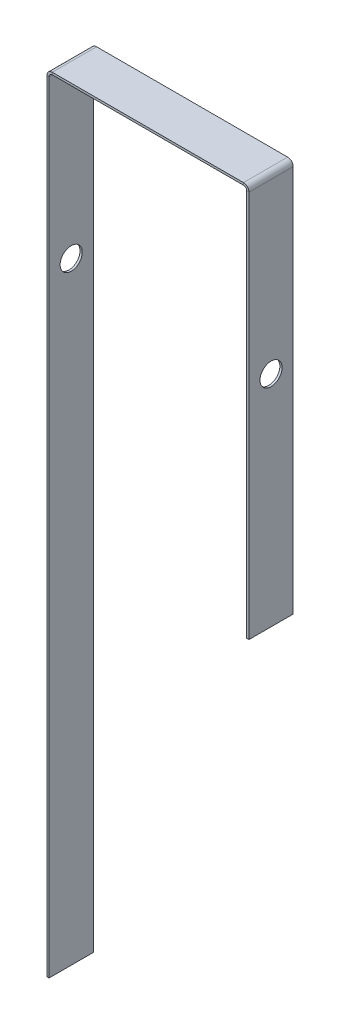
ISO-10303-21;
HEADER;
FILE_DESCRIPTION(('STEP AP214'),'2;1');
FILE_NAME('part.step','',(''),(''),'','','');
FILE_SCHEMA(('AUTOMOTIVE_DESIGN { 1 0 10303 214 1 1 1 1 }'));
ENDSEC;
DATA;
#1=APPLICATION_CONTEXT('core data for automotive mechanical design processes');
#2=APPLICATION_PROTOCOL_DEFINITION('international standard','automotive_design',2000,#1);
#3=PRODUCT_CONTEXT('',#1,'mechanical');
#4=PRODUCT('Part','Part','',(#3));
#5=PRODUCT_RELATED_PRODUCT_CATEGORY('part','',(#4));
#6=PRODUCT_DEFINITION_FORMATION('','',#4);
#7=PRODUCT_DEFINITION_CONTEXT('part definition',#1,'design');
#8=PRODUCT_DEFINITION('design','',#6,#7);
#9=PRODUCT_DEFINITION_SHAPE('','',#8);
#10=(LENGTH_UNIT() NAMED_UNIT(*) SI_UNIT(.MILLI.,.METRE.));
#11=(NAMED_UNIT(*) PLANE_ANGLE_UNIT() SI_UNIT($,.RADIAN.));
#12=(NAMED_UNIT(*) SI_UNIT($,.STERADIAN.) SOLID_ANGLE_UNIT());
#13=UNCERTAINTY_MEASURE_WITH_UNIT(LENGTH_MEASURE(1.E-05),#10,'distance_accuracy_value','');
#14=(GEOMETRIC_REPRESENTATION_CONTEXT(3) GLOBAL_UNCERTAINTY_ASSIGNED_CONTEXT((#13)) GLOBAL_UNIT_ASSIGNED_CONTEXT((#10,
#11,#12)) REPRESENTATION_CONTEXT('',''));
#15=CARTESIAN_POINT('',(0.,0.,0.));
#16=DIRECTION('',(0.,0.,1.));
#17=DIRECTION('',(1.,0.,0.));
#18=AXIS2_PLACEMENT_3D('',#15,#16,#17);
#19=CARTESIAN_POINT('',(-69.7062096522603,140.428140243275,10.));
#20=DIRECTION('',(0.,0.,1.));
#21=DIRECTION('',(1.,0.,0.));
#22=AXIS2_PLACEMENT_3D('',#19,#20,#21);
#23=PLANE('',#22);
#24=DIRECTION('',(0.,-1.,0.));
#25=VECTOR('',#24,1.);
#26=CARTESIAN_POINT('',(-69.7062096522603,140.428140243275,10.));
#27=LINE('',#26,#25);
#28=CARTESIAN_POINT('',(-69.7062096522603,140.428140243275,10.));
#29=VERTEX_POINT('',#28);
#30=CARTESIAN_POINT('',(-69.7062096522603,139.920140243275,10.));
#31=VERTEX_POINT('',#30);
#32=EDGE_CURVE('E11',#29,#31,#27,.T.);
#33=ORIENTED_EDGE('',*,*,#32,.F.);
#34=CARTESIAN_POINT('',(-69.7062096522603,139.183540243275,10.));
#35=DIRECTION('',(0.,0.,1.));
#36=DIRECTION('',(1.,0.,0.));
#37=AXIS2_PLACEMENT_3D('',#34,#35,#36);
#38=CIRCLE('',#37,1.2446);
#39=CARTESIAN_POINT('',(-70.9508096522603,139.183540243275,10.));
#40=VERTEX_POINT('',#39);
#41=EDGE_CURVE('E250',#40,#29,#38,.F.);
#42=ORIENTED_EDGE('',*,*,#41,.F.);
#43=DIRECTION('',(-1.,0.,0.));
#44=VECTOR('',#43,1.);
#45=CARTESIAN_POINT('',(-70.4428096522603,139.183540243275,10.));
#46=LINE('',#45,#44);
#47=CARTESIAN_POINT('',(-70.4428096522603,139.183540243275,10.));
#48=VERTEX_POINT('',#47);
#49=EDGE_CURVE('E46',#48,#40,#46,.T.);
#50=ORIENTED_EDGE('',*,*,#49,.F.);
#51=CARTESIAN_POINT('',(-69.7062096522603,139.183540243275,10.));
#52=DIRECTION('',(0.,0.,1.));
#53=DIRECTION('',(1.,0.,0.));
#54=AXIS2_PLACEMENT_3D('',#51,#52,#53);
#55=CIRCLE('',#54,0.7366);
#56=EDGE_CURVE('E147',#48,#31,#55,.F.);
#57=ORIENTED_EDGE('',*,*,#56,.T.);
#58=EDGE_LOOP('',(#33,#42,#50,#57));
#59=FACE_BOUND('',#58,.T.);
#60=ADVANCED_FACE('F37',(#59),#23,.T.);
#61=CARTESIAN_POINT('',(-70.4428096522603,139.183540243275,10.));
#62=DIRECTION('',(0.,0.,1.));
#63=DIRECTION('',(1.,0.,0.));
#64=AXIS2_PLACEMENT_3D('',#61,#62,#63);
#65=PLANE('',#64);
#66=DIRECTION('',(1.,0.,0.));
#67=VECTOR('',#66,1.);
#68=CARTESIAN_POINT('',(-70.9508096522603,140.428140243275,10.));
#69=LINE('',#68,#67);
#70=CARTESIAN_POINT('',(-26.4754096522603,140.428140243275,10.));
#71=VERTEX_POINT('',#70);
#72=EDGE_CURVE('E141',#29,#71,#69,.T.);
#73=ORIENTED_EDGE('',*,*,#72,.F.);
#74=ORIENTED_EDGE('',*,*,#32,.T.);
#75=DIRECTION('',(1.,0.,0.));
#76=VECTOR('',#75,1.);
#77=CARTESIAN_POINT('',(-70.9508096522603,139.920140243275,10.));
#78=LINE('',#77,#76);
#79=CARTESIAN_POINT('',(-26.4754096522603,139.920140243275,10.));
#80=VERTEX_POINT('',#79);
#81=EDGE_CURVE('E138',#31,#80,#78,.T.);
#82=ORIENTED_EDGE('',*,*,#81,.T.);
#83=DIRECTION('',(0.,1.,0.));
#84=VECTOR('',#83,1.);
#85=CARTESIAN_POINT('',(-26.4754096522603,139.920140243275,10.));
#86=LINE('',#85,#84);
#87=EDGE_CURVE('E230',#80,#71,#86,.T.);
#88=ORIENTED_EDGE('',*,*,#87,.T.);
#89=EDGE_LOOP('',(#73,#74,#82,#88));
#90=FACE_BOUND('',#89,.T.);
#91=ADVANCED_FACE('F136',(#90),#65,.T.);
#92=CARTESIAN_POINT('',(-70.9508096522603,139.183540243275,0.));
#93=DIRECTION('',(0.,0.,-1.));
#94=DIRECTION('',(-1.,0.,0.));
#95=AXIS2_PLACEMENT_3D('',#92,#93,#94);
#96=PLANE('',#95);
#97=DIRECTION('',(1.,0.,0.));
#98=VECTOR('',#97,1.);
#99=CARTESIAN_POINT('',(-70.9508096522603,139.183540243275,0.));
#100=LINE('',#99,#98);
#101=CARTESIAN_POINT('',(-70.9508096522603,139.183540243275,0.));
#102=VERTEX_POINT('',#101);
#103=CARTESIAN_POINT('',(-70.4428096522603,139.183540243275,0.));
#104=VERTEX_POINT('',#103);
#105=EDGE_CURVE('E235',#102,#104,#100,.T.);
#106=ORIENTED_EDGE('',*,*,#105,.F.);
#107=CARTESIAN_POINT('',(-69.7062096522603,139.183540243275,0.));
#108=DIRECTION('',(0.,0.,1.));
#109=DIRECTION('',(1.,0.,0.));
#110=AXIS2_PLACEMENT_3D('',#107,#108,#109);
#111=CIRCLE('',#110,1.2446);
#112=CARTESIAN_POINT('',(-69.7062096522603,140.428140243275,0.));
#113=VERTEX_POINT('',#112);
#114=EDGE_CURVE('E187',#102,#113,#111,.F.);
#115=ORIENTED_EDGE('',*,*,#114,.T.);
#116=DIRECTION('',(0.,1.,0.));
#117=VECTOR('',#116,1.);
#118=CARTESIAN_POINT('',(-69.7062096522603,139.920140243275,0.));
#119=LINE('',#118,#117);
#120=CARTESIAN_POINT('',(-69.7062096522603,139.920140243275,0.));
#121=VERTEX_POINT('',#120);
#122=EDGE_CURVE('E233',#121,#113,#119,.T.);
#123=ORIENTED_EDGE('',*,*,#122,.F.);
#124=CARTESIAN_POINT('',(-69.7062096522603,139.183540243275,0.));
#125=DIRECTION('',(0.,0.,1.));
#126=DIRECTION('',(1.,0.,0.));
#127=AXIS2_PLACEMENT_3D('',#124,#125,#126);
#128=CIRCLE('',#127,0.7366);
#129=EDGE_CURVE('E159',#104,#121,#128,.F.);
#130=ORIENTED_EDGE('',*,*,#129,.F.);
#131=EDGE_LOOP('',(#106,#115,#123,#130));
#132=FACE_BOUND('',#131,.T.);
#133=ADVANCED_FACE('F303',(#132),#96,.T.);
#134=CARTESIAN_POINT('',(-69.7062096522603,139.920140243275,0.));
#135=DIRECTION('',(0.,0.,-1.));
#136=DIRECTION('',(-1.,0.,0.));
#137=AXIS2_PLACEMENT_3D('',#134,#135,#136);
#138=PLANE('',#137);
#139=DIRECTION('',(0.,1.,0.));
#140=VECTOR('',#139,1.);
#141=CARTESIAN_POINT('',(-70.9508096522603,-37.3718597567248,0.));
#142=LINE('',#141,#140);
#143=CARTESIAN_POINT('',(-70.9508096522603,-37.3718597567248,0.));
#144=VERTEX_POINT('',#143);
#145=EDGE_CURVE('E190',#144,#102,#142,.T.);
#146=ORIENTED_EDGE('',*,*,#145,.T.);
#147=ORIENTED_EDGE('',*,*,#105,.T.);
#148=DIRECTION('',(0.,1.,0.));
#149=VECTOR('',#148,1.);
#150=CARTESIAN_POINT('',(-70.4428096522603,-37.3718597567248,0.));
#151=LINE('',#150,#149);
#152=CARTESIAN_POINT('',(-70.4428096522603,-37.3718597567248,0.));
#153=VERTEX_POINT('',#152);
#154=EDGE_CURVE('E196',#153,#104,#151,.T.);
#155=ORIENTED_EDGE('',*,*,#154,.F.);
#156=DIRECTION('',(-1.,0.,0.));
#157=VECTOR('',#156,1.);
#158=CARTESIAN_POINT('',(-70.4428096522603,-37.3718597567248,0.));
#159=LINE('',#158,#157);
#160=EDGE_CURVE('E193',#153,#144,#159,.T.);
#161=ORIENTED_EDGE('',*,*,#160,.T.);
#162=EDGE_LOOP('',(#146,#147,#155,#161));
#163=FACE_BOUND('',#162,.T.);
#164=ADVANCED_FACE('F307',(#163),#138,.T.);
#165=CARTESIAN_POINT('',(-25.2308096522603,139.183540243275,10.));
#166=DIRECTION('',(0.,0.,1.));
#167=DIRECTION('',(1.,0.,0.));
#168=AXIS2_PLACEMENT_3D('',#165,#166,#167);
#169=PLANE('',#168);
#170=DIRECTION('',(-1.,0.,0.));
#171=VECTOR('',#170,1.);
#172=CARTESIAN_POINT('',(-25.2308096522603,139.183540243275,10.));
#173=LINE('',#172,#171);
#174=CARTESIAN_POINT('',(-25.2308096522603,139.183540243275,10.));
#175=VERTEX_POINT('',#174);
#176=CARTESIAN_POINT('',(-25.7388096522603,139.183540243275,10.));
#177=VERTEX_POINT('',#176);
#178=EDGE_CURVE('E54',#175,#177,#173,.T.);
#179=ORIENTED_EDGE('',*,*,#178,.F.);
#180=CARTESIAN_POINT('',(-26.4754096522603,139.183540243275,10.));
#181=DIRECTION('',(0.,0.,1.));
#182=DIRECTION('',(1.,0.,0.));
#183=AXIS2_PLACEMENT_3D('',#180,#181,#182);
#184=CIRCLE('',#183,1.2446);
#185=EDGE_CURVE('E260',#71,#175,#184,.F.);
#186=ORIENTED_EDGE('',*,*,#185,.F.);
#187=ORIENTED_EDGE('',*,*,#87,.F.);
#188=CARTESIAN_POINT('',(-26.4754096522603,139.183540243275,10.));
#189=DIRECTION('',(0.,0.,1.));
#190=DIRECTION('',(1.,0.,0.));
#191=AXIS2_PLACEMENT_3D('',#188,#189,#190);
#192=CIRCLE('',#191,0.7366);
#193=EDGE_CURVE('E167',#80,#177,#192,.F.);
#194=ORIENTED_EDGE('',*,*,#193,.T.);
#195=EDGE_LOOP('',(#179,#186,#187,#194));
#196=FACE_BOUND('',#195,.T.);
#197=ADVANCED_FACE('F313',(#196),#169,.T.);
#198=CARTESIAN_POINT('',(-26.4754096522603,139.920140243275,10.));
#199=DIRECTION('',(0.,0.,1.));
#200=DIRECTION('',(1.,0.,0.));
#201=AXIS2_PLACEMENT_3D('',#198,#199,#200);
#202=PLANE('',#201);
#203=DIRECTION('',(0.,-1.,0.));
#204=VECTOR('',#203,1.);
#205=CARTESIAN_POINT('',(-25.2308096522603,140.428140243275,10.));
#206=LINE('',#205,#204);
#207=CARTESIAN_POINT('',(-25.2308096522603,51.5281402432752,10.));
#208=VERTEX_POINT('',#207);
#209=EDGE_CURVE('E263',#175,#208,#206,.T.);
#210=ORIENTED_EDGE('',*,*,#209,.F.);
#211=ORIENTED_EDGE('',*,*,#178,.T.);
#212=DIRECTION('',(0.,1.,0.));
#213=VECTOR('',#212,1.);
#214=CARTESIAN_POINT('',(-25.7388096522603,140.428140243275,10.));
#215=LINE('',#214,#213);
#216=CARTESIAN_POINT('',(-25.7388096522603,51.5281402432752,10.));
#217=VERTEX_POINT('',#216);
#218=EDGE_CURVE('E108',#177,#217,#215,.F.);
#219=ORIENTED_EDGE('',*,*,#218,.T.);
#220=DIRECTION('',(-1.,0.,0.));
#221=VECTOR('',#220,1.);
#222=CARTESIAN_POINT('',(-25.2308096522603,51.5281402432752,10.));
#223=LINE('',#222,#221);
#224=EDGE_CURVE('E266',#208,#217,#223,.T.);
#225=ORIENTED_EDGE('',*,*,#224,.F.);
#226=EDGE_LOOP('',(#210,#211,#219,#225));
#227=FACE_BOUND('',#226,.T.);
#228=ADVANCED_FACE('F317',(#227),#202,.T.);
#229=CARTESIAN_POINT('',(-26.4754096522603,140.428140243275,0.));
#230=DIRECTION('',(0.,0.,-1.));
#231=DIRECTION('',(-1.,0.,0.));
#232=AXIS2_PLACEMENT_3D('',#229,#230,#231);
#233=PLANE('',#232);
#234=DIRECTION('',(0.,-1.,0.));
#235=VECTOR('',#234,1.);
#236=CARTESIAN_POINT('',(-26.4754096522603,140.428140243275,0.));
#237=LINE('',#236,#235);
#238=CARTESIAN_POINT('',(-26.4754096522603,140.428140243275,0.));
#239=VERTEX_POINT('',#238);
#240=CARTESIAN_POINT('',(-26.4754096522603,139.920140243275,0.));
#241=VERTEX_POINT('',#240);
#242=EDGE_CURVE('E95',#239,#241,#237,.T.);
#243=ORIENTED_EDGE('',*,*,#242,.F.);
#244=CARTESIAN_POINT('',(-26.4754096522603,139.183540243275,0.));
#245=DIRECTION('',(0.,0.,1.));
#246=DIRECTION('',(1.,0.,0.));
#247=AXIS2_PLACEMENT_3D('',#244,#245,#246);
#248=CIRCLE('',#247,1.2446);
#249=CARTESIAN_POINT('',(-25.2308096522603,139.183540243275,0.));
#250=VERTEX_POINT('',#249);
#251=EDGE_CURVE('E183',#239,#250,#248,.F.);
#252=ORIENTED_EDGE('',*,*,#251,.T.);
#253=DIRECTION('',(1.,0.,0.));
#254=VECTOR('',#253,1.);
#255=CARTESIAN_POINT('',(-25.7388096522603,139.183540243275,0.));
#256=LINE('',#255,#254);
#257=CARTESIAN_POINT('',(-25.7388096522603,139.183540243275,0.));
#258=VERTEX_POINT('',#257);
#259=EDGE_CURVE('E102',#258,#250,#256,.T.);
#260=ORIENTED_EDGE('',*,*,#259,.F.);
#261=CARTESIAN_POINT('',(-26.4754096522603,139.183540243275,0.));
#262=DIRECTION('',(0.,0.,1.));
#263=DIRECTION('',(1.,0.,0.));
#264=AXIS2_PLACEMENT_3D('',#261,#262,#263);
#265=CIRCLE('',#264,0.7366);
#266=EDGE_CURVE('E202',#241,#258,#265,.F.);
#267=ORIENTED_EDGE('',*,*,#266,.F.);
#268=EDGE_LOOP('',(#243,#252,#260,#267));
#269=FACE_BOUND('',#268,.T.);
#270=ADVANCED_FACE('F321',(#269),#233,.T.);
#271=CARTESIAN_POINT('',(-25.7388096522603,139.183540243275,0.));
#272=DIRECTION('',(0.,0.,-1.));
#273=DIRECTION('',(-1.,0.,0.));
#274=AXIS2_PLACEMENT_3D('',#271,#272,#273);
#275=PLANE('',#274);
#276=DIRECTION('',(1.,0.,0.));
#277=VECTOR('',#276,1.);
#278=CARTESIAN_POINT('',(-70.9508096522603,140.428140243275,0.));
#279=LINE('',#278,#277);
#280=EDGE_CURVE('E185',#113,#239,#279,.T.);
#281=ORIENTED_EDGE('',*,*,#280,.T.);
#282=ORIENTED_EDGE('',*,*,#242,.T.);
#283=DIRECTION('',(1.,0.,0.));
#284=VECTOR('',#283,1.);
#285=CARTESIAN_POINT('',(-70.9508096522603,139.920140243275,0.));
#286=LINE('',#285,#284);
#287=EDGE_CURVE('E200',#121,#241,#286,.T.);
#288=ORIENTED_EDGE('',*,*,#287,.F.);
#289=ORIENTED_EDGE('',*,*,#122,.T.);
#290=EDGE_LOOP('',(#281,#282,#288,#289));
#291=FACE_BOUND('',#290,.T.);
#292=ADVANCED_FACE('F324',(#291),#275,.T.);
#293=CARTESIAN_POINT('',(-25.7388096522603,140.428140243275,10.));
#294=DIRECTION('',(1.,0.,0.));
#295=DIRECTION('',(0.,0.,-1.));
#296=AXIS2_PLACEMENT_3D('',#293,#294,#295);
#297=PLANE('',#296);
#298=CARTESIAN_POINT('',(-25.7388096522603,101.083540243275,5.));
#299=DIRECTION('',(1.,0.,0.));
#300=DIRECTION('',(0.,0.,-1.));
#301=AXIS2_PLACEMENT_3D('',#298,#299,#300);
#302=CIRCLE('',#301,2.5);
#303=CARTESIAN_POINT('',(-25.7388096522603,101.083540243275,2.5));
#304=VERTEX_POINT('',#303);
#305=EDGE_CURVE('E177',#304,#304,#302,.T.);
#306=ORIENTED_EDGE('',*,*,#305,.T.);
#307=EDGE_LOOP('',(#306));
#308=FACE_BOUND('',#307,.T.);
#309=DIRECTION('',(0.,1.,0.));
#310=VECTOR('',#309,1.);
#311=CARTESIAN_POINT('',(-25.7388096522603,140.428140243275,0.));
#312=LINE('',#311,#310);
#313=CARTESIAN_POINT('',(-25.7388096522603,51.5281402432752,0.));
#314=VERTEX_POINT('',#313);
#315=EDGE_CURVE('E173',#258,#314,#312,.F.);
#316=ORIENTED_EDGE('',*,*,#315,.T.);
#317=DIRECTION('',(0.,0.,-1.));
#318=VECTOR('',#317,1.);
#319=CARTESIAN_POINT('',(-25.7388096522603,51.5281402432752,10.));
#320=LINE('',#319,#318);
#321=EDGE_CURVE('E226',#217,#314,#320,.T.);
#322=ORIENTED_EDGE('',*,*,#321,.F.);
#323=ORIENTED_EDGE('',*,*,#218,.F.);
#324=DIRECTION('',(0.,0.,-1.));
#325=VECTOR('',#324,1.);
#326=CARTESIAN_POINT('',(-25.7388096522603,139.183540243275,10.));
#327=LINE('',#326,#325);
#328=EDGE_CURVE('E169',#177,#258,#327,.T.);
#329=ORIENTED_EDGE('',*,*,#328,.T.);
#330=EDGE_LOOP('',(#316,#322,#323,#329));
#331=FACE_BOUND('',#330,.T.);
#332=ADVANCED_FACE('F327',(#308,#331),#297,.F.);
#333=CARTESIAN_POINT('',(-25.2308096522603,51.5281402432752,10.));
#334=DIRECTION('',(0.,-1.,0.));
#335=DIRECTION('',(0.,0.,-1.));
#336=AXIS2_PLACEMENT_3D('',#333,#334,#335);
#337=PLANE('',#336);
#338=DIRECTION('',(-1.,0.,0.));
#339=VECTOR('',#338,1.);
#340=CARTESIAN_POINT('',(-25.2308096522603,51.5281402432752,0.));
#341=LINE('',#340,#339);
#342=CARTESIAN_POINT('',(-25.2308096522603,51.5281402432752,0.));
#343=VERTEX_POINT('',#342);
#344=EDGE_CURVE('E176',#343,#314,#341,.T.);
#345=ORIENTED_EDGE('',*,*,#344,.F.);
#346=DIRECTION('',(0.,0.,-1.));
#347=VECTOR('',#346,1.);
#348=CARTESIAN_POINT('',(-25.2308096522603,51.5281402432752,10.));
#349=LINE('',#348,#347);
#350=EDGE_CURVE('E224',#208,#343,#349,.T.);
#351=ORIENTED_EDGE('',*,*,#350,.F.);
#352=ORIENTED_EDGE('',*,*,#224,.T.);
#353=ORIENTED_EDGE('',*,*,#321,.T.);
#354=EDGE_LOOP('',(#345,#351,#352,#353));
#355=FACE_BOUND('',#354,.T.);
#356=ADVANCED_FACE('F330',(#355),#337,.T.);
#357=CARTESIAN_POINT('',(-25.2308096522603,140.428140243275,10.));
#358=DIRECTION('',(1.,0.,0.));
#359=DIRECTION('',(0.,0.,-1.));
#360=AXIS2_PLACEMENT_3D('',#357,#358,#359);
#361=PLANE('',#360);
#362=CARTESIAN_POINT('',(-25.2308096522603,101.083540243275,5.));
#363=DIRECTION('',(-1.,0.,0.));
#364=DIRECTION('',(0.,0.,1.));
#365=AXIS2_PLACEMENT_3D('',#362,#363,#364);
#366=CIRCLE('',#365,2.5);
#367=CARTESIAN_POINT('',(-25.2308096522603,101.083540243275,7.50000000000001));
#368=VERTEX_POINT('',#367);
#369=EDGE_CURVE('E275',#368,#368,#366,.T.);
#370=ORIENTED_EDGE('',*,*,#369,.T.);
#371=EDGE_LOOP('',(#370));
#372=FACE_BOUND('',#371,.T.);
#373=DIRECTION('',(0.,-1.,0.));
#374=VECTOR('',#373,1.);
#375=CARTESIAN_POINT('',(-25.2308096522603,140.428140243275,0.));
#376=LINE('',#375,#374);
#377=EDGE_CURVE('E180',#250,#343,#376,.T.);
#378=ORIENTED_EDGE('',*,*,#377,.F.);
#379=DIRECTION('',(0.,0.,-1.));
#380=VECTOR('',#379,1.);
#381=CARTESIAN_POINT('',(-25.2308096522603,139.183540243275,10.));
#382=LINE('',#381,#380);
#383=EDGE_CURVE('E221',#175,#250,#382,.T.);
#384=ORIENTED_EDGE('',*,*,#383,.F.);
#385=ORIENTED_EDGE('',*,*,#209,.T.);
#386=ORIENTED_EDGE('',*,*,#350,.T.);
#387=EDGE_LOOP('',(#378,#384,#385,#386));
#388=FACE_BOUND('',#387,.T.);
#389=ADVANCED_FACE('F334',(#372,#388),#361,.T.);
#390=CARTESIAN_POINT('',(-26.4754096522603,139.183540243275,10.));
#391=DIRECTION('',(0.,0.,-1.));
#392=DIRECTION('',(-1.,0.,0.));
#393=AXIS2_PLACEMENT_3D('',#390,#391,#392);
#394=CYLINDRICAL_SURFACE('',#393,1.2446);
#395=ORIENTED_EDGE('',*,*,#251,.F.);
#396=DIRECTION('',(0.,0.,-1.));
#397=VECTOR('',#396,1.);
#398=CARTESIAN_POINT('',(-26.4754096522603,140.428140243275,10.));
#399=LINE('',#398,#397);
#400=EDGE_CURVE('E218',#71,#239,#399,.T.);
#401=ORIENTED_EDGE('',*,*,#400,.F.);
#402=ORIENTED_EDGE('',*,*,#185,.T.);
#403=ORIENTED_EDGE('',*,*,#383,.T.);
#404=EDGE_LOOP('',(#395,#401,#402,#403));
#405=FACE_BOUND('',#404,.T.);
#406=ADVANCED_FACE('F338',(#405),#394,.T.);
#407=CARTESIAN_POINT('',(-70.9508096522603,140.428140243275,10.));
#408=DIRECTION('',(0.,1.,0.));
#409=DIRECTION('',(0.,0.,1.));
#410=AXIS2_PLACEMENT_3D('',#407,#408,#409);
#411=PLANE('',#410);
#412=ORIENTED_EDGE('',*,*,#280,.F.);
#413=DIRECTION('',(0.,0.,-1.));
#414=VECTOR('',#413,1.);
#415=CARTESIAN_POINT('',(-69.7062096522603,140.428140243275,10.));
#416=LINE('',#415,#414);
#417=EDGE_CURVE('E215',#29,#113,#416,.T.);
#418=ORIENTED_EDGE('',*,*,#417,.F.);
#419=ORIENTED_EDGE('',*,*,#72,.T.);
#420=ORIENTED_EDGE('',*,*,#400,.T.);
#421=EDGE_LOOP('',(#412,#418,#419,#420));
#422=FACE_BOUND('',#421,.T.);
#423=ADVANCED_FACE('F341',(#422),#411,.T.);
#424=CARTESIAN_POINT('',(-69.7062096522603,139.183540243275,10.));
#425=DIRECTION('',(0.,0.,-1.));
#426=DIRECTION('',(-1.,0.,0.));
#427=AXIS2_PLACEMENT_3D('',#424,#425,#426);
#428=CYLINDRICAL_SURFACE('',#427,1.2446);
#429=ORIENTED_EDGE('',*,*,#114,.F.);
#430=DIRECTION('',(0.,0.,-1.));
#431=VECTOR('',#430,1.);
#432=CARTESIAN_POINT('',(-70.9508096522603,139.183540243275,10.));
#433=LINE('',#432,#431);
#434=EDGE_CURVE('E212',#40,#102,#433,.T.);
#435=ORIENTED_EDGE('',*,*,#434,.F.);
#436=ORIENTED_EDGE('',*,*,#41,.T.);
#437=ORIENTED_EDGE('',*,*,#417,.T.);
#438=EDGE_LOOP('',(#429,#435,#436,#437));
#439=FACE_BOUND('',#438,.T.);
#440=ADVANCED_FACE('F249',(#439),#428,.T.);
#441=CARTESIAN_POINT('',(-70.9508096522603,-37.3718597567248,10.));
#442=DIRECTION('',(-1.,0.,0.));
#443=DIRECTION('',(0.,0.,1.));
#444=AXIS2_PLACEMENT_3D('',#441,#442,#443);
#445=PLANE('',#444);
#446=CARTESIAN_POINT('',(-70.9508096522603,101.083540243275,5.));
#447=DIRECTION('',(-1.,0.,0.));
#448=DIRECTION('',(0.,0.,1.));
#449=AXIS2_PLACEMENT_3D('',#446,#447,#448);
#450=CIRCLE('',#449,2.5);
#451=CARTESIAN_POINT('',(-70.9508096522603,101.083540243275,7.50000000000001));
#452=VERTEX_POINT('',#451);
#453=EDGE_CURVE('E272',#452,#452,#450,.T.);
#454=ORIENTED_EDGE('',*,*,#453,.F.);
#455=EDGE_LOOP('',(#454));
#456=FACE_BOUND('',#455,.T.);
#457=ORIENTED_EDGE('',*,*,#145,.F.);
#458=DIRECTION('',(0.,0.,-1.));
#459=VECTOR('',#458,1.);
#460=CARTESIAN_POINT('',(-70.9508096522603,-37.3718597567248,10.));
#461=LINE('',#460,#459);
#462=CARTESIAN_POINT('',(-70.9508096522603,-37.3718597567248,10.));
#463=VERTEX_POINT('',#462);
#464=EDGE_CURVE('E210',#463,#144,#461,.T.);
#465=ORIENTED_EDGE('',*,*,#464,.F.);
#466=DIRECTION('',(0.,1.,0.));
#467=VECTOR('',#466,1.);
#468=CARTESIAN_POINT('',(-70.9508096522603,-37.3718597567248,10.));
#469=LINE('',#468,#467);
#470=EDGE_CURVE('E243',#463,#40,#469,.T.);
#471=ORIENTED_EDGE('',*,*,#470,.T.);
#472=ORIENTED_EDGE('',*,*,#434,.T.);
#473=EDGE_LOOP('',(#457,#465,#471,#472));
#474=FACE_BOUND('',#473,.T.);
#475=ADVANCED_FACE('F254',(#456,#474),#445,.T.);
#476=CARTESIAN_POINT('',(-70.4428096522603,-37.3718597567248,10.));
#477=DIRECTION('',(0.,-1.,0.));
#478=DIRECTION('',(0.,0.,-1.));
#479=AXIS2_PLACEMENT_3D('',#476,#477,#478);
#480=PLANE('',#479);
#481=ORIENTED_EDGE('',*,*,#160,.F.);
#482=DIRECTION('',(0.,0.,-1.));
#483=VECTOR('',#482,1.);
#484=CARTESIAN_POINT('',(-70.4428096522603,-37.3718597567248,10.));
#485=LINE('',#484,#483);
#486=CARTESIAN_POINT('',(-70.4428096522603,-37.3718597567248,10.));
#487=VERTEX_POINT('',#486);
#488=EDGE_CURVE('E208',#487,#153,#485,.T.);
#489=ORIENTED_EDGE('',*,*,#488,.F.);
#490=DIRECTION('',(-1.,0.,0.));
#491=VECTOR('',#490,1.);
#492=CARTESIAN_POINT('',(-70.4428096522603,-37.3718597567248,10.));
#493=LINE('',#492,#491);
#494=EDGE_CURVE('E255',#487,#463,#493,.T.);
#495=ORIENTED_EDGE('',*,*,#494,.T.);
#496=ORIENTED_EDGE('',*,*,#464,.T.);
#497=EDGE_LOOP('',(#481,#489,#495,#496));
#498=FACE_BOUND('',#497,.T.);
#499=ADVANCED_FACE('F350',(#498),#480,.T.);
#500=CARTESIAN_POINT('',(-70.4428096522603,-37.3718597567248,10.));
#501=DIRECTION('',(-1.,0.,0.));
#502=DIRECTION('',(0.,0.,1.));
#503=AXIS2_PLACEMENT_3D('',#500,#501,#502);
#504=PLANE('',#503);
#505=CARTESIAN_POINT('',(-70.4428096522603,101.083540243275,5.));
#506=DIRECTION('',(-1.,0.,0.));
#507=DIRECTION('',(0.,0.,1.));
#508=AXIS2_PLACEMENT_3D('',#505,#506,#507);
#509=CIRCLE('',#508,2.5);
#510=CARTESIAN_POINT('',(-70.4428096522603,101.083540243275,7.50000000000001));
#511=VERTEX_POINT('',#510);
#512=EDGE_CURVE('E40',#511,#511,#509,.T.);
#513=ORIENTED_EDGE('',*,*,#512,.T.);
#514=EDGE_LOOP('',(#513));
#515=FACE_BOUND('',#514,.T.);
#516=ORIENTED_EDGE('',*,*,#154,.T.);
#517=DIRECTION('',(0.,0.,-1.));
#518=VECTOR('',#517,1.);
#519=CARTESIAN_POINT('',(-70.4428096522603,139.183540243275,10.));
#520=LINE('',#519,#518);
#521=EDGE_CURVE('E161',#48,#104,#520,.T.);
#522=ORIENTED_EDGE('',*,*,#521,.F.);
#523=DIRECTION('',(0.,1.,0.));
#524=VECTOR('',#523,1.);
#525=CARTESIAN_POINT('',(-70.4428096522603,-37.3718597567248,10.));
#526=LINE('',#525,#524);
#527=EDGE_CURVE('E152',#487,#48,#526,.T.);
#528=ORIENTED_EDGE('',*,*,#527,.F.);
#529=ORIENTED_EDGE('',*,*,#488,.T.);
#530=EDGE_LOOP('',(#516,#522,#528,#529));
#531=FACE_BOUND('',#530,.T.);
#532=ADVANCED_FACE('F282',(#515,#531),#504,.F.);
#533=CARTESIAN_POINT('',(-69.7062096522603,139.183540243275,10.));
#534=DIRECTION('',(0.,0.,-1.));
#535=DIRECTION('',(-1.,0.,0.));
#536=AXIS2_PLACEMENT_3D('',#533,#534,#535);
#537=CYLINDRICAL_SURFACE('',#536,0.7366);
#538=ORIENTED_EDGE('',*,*,#129,.T.);
#539=DIRECTION('',(0.,0.,-1.));
#540=VECTOR('',#539,1.);
#541=CARTESIAN_POINT('',(-69.7062096522603,139.920140243275,10.));
#542=LINE('',#541,#540);
#543=EDGE_CURVE('E156',#31,#121,#542,.T.);
#544=ORIENTED_EDGE('',*,*,#543,.F.);
#545=ORIENTED_EDGE('',*,*,#56,.F.);
#546=ORIENTED_EDGE('',*,*,#521,.T.);
#547=EDGE_LOOP('',(#538,#544,#545,#546));
#548=FACE_BOUND('',#547,.T.);
#549=ADVANCED_FACE('F157',(#548),#537,.F.);
#550=CARTESIAN_POINT('',(-70.9508096522603,139.920140243275,10.));
#551=DIRECTION('',(0.,1.,0.));
#552=DIRECTION('',(0.,0.,1.));
#553=AXIS2_PLACEMENT_3D('',#550,#551,#552);
#554=PLANE('',#553);
#555=ORIENTED_EDGE('',*,*,#287,.T.);
#556=DIRECTION('',(0.,0.,-1.));
#557=VECTOR('',#556,1.);
#558=CARTESIAN_POINT('',(-26.4754096522603,139.920140243275,10.));
#559=LINE('',#558,#557);
#560=EDGE_CURVE('E162',#80,#241,#559,.T.);
#561=ORIENTED_EDGE('',*,*,#560,.F.);
#562=ORIENTED_EDGE('',*,*,#81,.F.);
#563=ORIENTED_EDGE('',*,*,#543,.T.);
#564=EDGE_LOOP('',(#555,#561,#562,#563));
#565=FACE_BOUND('',#564,.T.);
#566=ADVANCED_FACE('F164',(#565),#554,.F.);
#567=CARTESIAN_POINT('',(-26.4754096522603,139.183540243275,10.));
#568=DIRECTION('',(0.,0.,-1.));
#569=DIRECTION('',(-1.,0.,0.));
#570=AXIS2_PLACEMENT_3D('',#567,#568,#569);
#571=CYLINDRICAL_SURFACE('',#570,0.7366);
#572=ORIENTED_EDGE('',*,*,#266,.T.);
#573=ORIENTED_EDGE('',*,*,#328,.F.);
#574=ORIENTED_EDGE('',*,*,#193,.F.);
#575=ORIENTED_EDGE('',*,*,#560,.T.);
#576=EDGE_LOOP('',(#572,#573,#574,#575));
#577=FACE_BOUND('',#576,.T.);
#578=ADVANCED_FACE('F361',(#577),#571,.F.);
#579=CARTESIAN_POINT('',(-26.4754096522603,139.183540243275,10.));
#580=DIRECTION('',(0.,0.,1.));
#581=DIRECTION('',(1.,0.,0.));
#582=AXIS2_PLACEMENT_3D('',#579,#580,#581);
#583=PLANE('',#582);
#584=ORIENTED_EDGE('',*,*,#527,.T.);
#585=ORIENTED_EDGE('',*,*,#49,.T.);
#586=ORIENTED_EDGE('',*,*,#470,.F.);
#587=ORIENTED_EDGE('',*,*,#494,.F.);
#588=EDGE_LOOP('',(#584,#585,#586,#587));
#589=FACE_BOUND('',#588,.T.);
#590=ADVANCED_FACE('F240',(#589),#583,.T.);
#591=CARTESIAN_POINT('',(-26.4754096522603,139.183540243275,0.));
#592=DIRECTION('',(0.,0.,1.));
#593=DIRECTION('',(1.,0.,0.));
#594=AXIS2_PLACEMENT_3D('',#591,#592,#593);
#595=PLANE('',#594);
#596=ORIENTED_EDGE('',*,*,#315,.F.);
#597=ORIENTED_EDGE('',*,*,#259,.T.);
#598=ORIENTED_EDGE('',*,*,#377,.T.);
#599=ORIENTED_EDGE('',*,*,#344,.T.);
#600=EDGE_LOOP('',(#596,#597,#598,#599));
#601=FACE_BOUND('',#600,.T.);
#602=ADVANCED_FACE('F288',(#601),#595,.F.);
#603=CARTESIAN_POINT('',(-25.2308096522603,101.083540243275,5.));
#604=DIRECTION('',(-1.,0.,0.));
#605=DIRECTION('',(0.,0.,1.));
#606=AXIS2_PLACEMENT_3D('',#603,#604,#605);
#607=CYLINDRICAL_SURFACE('',#606,2.5);
#608=ORIENTED_EDGE('',*,*,#453,.T.);
#609=EDGE_LOOP('',(#608));
#610=FACE_BOUND('',#609,.T.);
#611=ORIENTED_EDGE('',*,*,#512,.F.);
#612=EDGE_LOOP('',(#611));
#613=FACE_BOUND('',#612,.T.);
#614=ADVANCED_FACE('F285',(#610,#613),#607,.F.);
#615=ORIENTED_EDGE('',*,*,#369,.F.);
#616=EDGE_LOOP('',(#615));
#617=FACE_BOUND('',#616,.T.);
#618=ORIENTED_EDGE('',*,*,#305,.F.);
#619=EDGE_LOOP('',(#618));
#620=FACE_BOUND('',#619,.T.);
#621=ADVANCED_FACE('F287',(#617,#620),#607,.F.);
#622=CLOSED_SHELL('',(#60,#91,#133,#164,#197,#228,#270,#292,#332,#356,#389,#406,#423,#440,#475,
#499,#532,#549,#566,#578,#590,#602,#614,#621));
#623=MANIFOLD_SOLID_BREP('B2',#622);
#624=ADVANCED_BREP_SHAPE_REPRESENTATION('',(#18,#623),#14);
#625=SHAPE_DEFINITION_REPRESENTATION(#9,#624);
ENDSEC;
END-ISO-10303-21;
